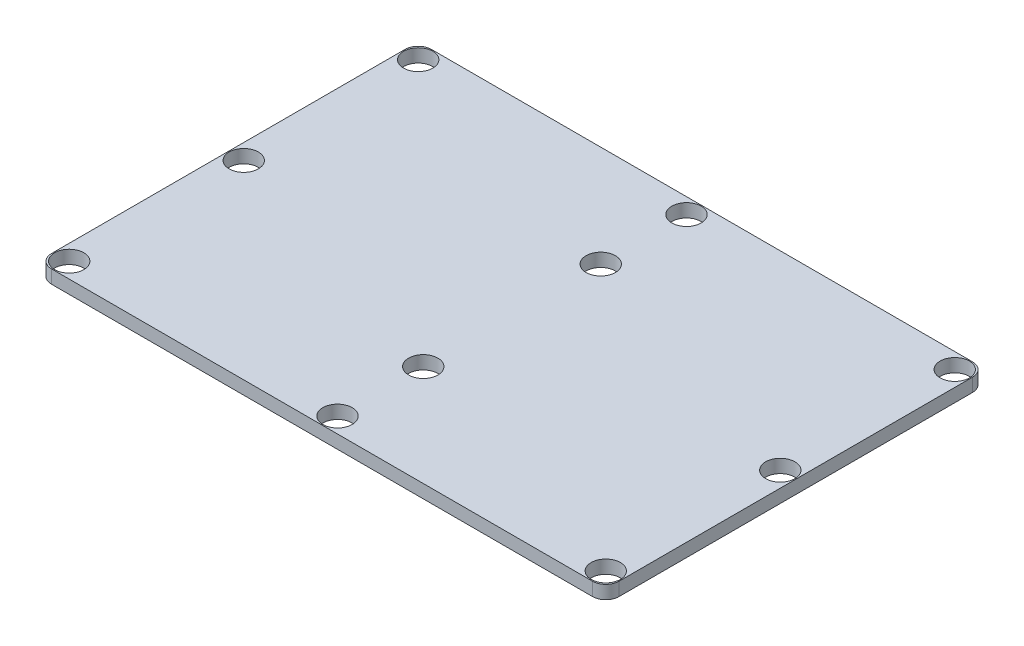
ISO-10303-21;
HEADER;
FILE_DESCRIPTION(('STEP AP214'),'2;1');
FILE_NAME('part.step','',(''),(''),'','','');
FILE_SCHEMA(('AUTOMOTIVE_DESIGN { 1 0 10303 214 1 1 1 1 }'));
ENDSEC;
DATA;
#1=APPLICATION_CONTEXT('core data for automotive mechanical design processes');
#2=APPLICATION_PROTOCOL_DEFINITION('international standard','automotive_design',2000,#1);
#3=PRODUCT_CONTEXT('',#1,'mechanical');
#4=PRODUCT('Part','Part','',(#3));
#5=PRODUCT_RELATED_PRODUCT_CATEGORY('part','',(#4));
#6=PRODUCT_DEFINITION_FORMATION('','',#4);
#7=PRODUCT_DEFINITION_CONTEXT('part definition',#1,'design');
#8=PRODUCT_DEFINITION('design','',#6,#7);
#9=PRODUCT_DEFINITION_SHAPE('','',#8);
#10=(LENGTH_UNIT() NAMED_UNIT(*) SI_UNIT(.MILLI.,.METRE.));
#11=(NAMED_UNIT(*) PLANE_ANGLE_UNIT() SI_UNIT($,.RADIAN.));
#12=(NAMED_UNIT(*) SI_UNIT($,.STERADIAN.) SOLID_ANGLE_UNIT());
#13=UNCERTAINTY_MEASURE_WITH_UNIT(LENGTH_MEASURE(1.E-05),#10,'distance_accuracy_value','');
#14=(GEOMETRIC_REPRESENTATION_CONTEXT(3) GLOBAL_UNCERTAINTY_ASSIGNED_CONTEXT((#13)) GLOBAL_UNIT_ASSIGNED_CONTEXT((#10,
#11,#12)) REPRESENTATION_CONTEXT('',''));
#15=CARTESIAN_POINT('',(0.,0.,0.));
#16=DIRECTION('',(0.,0.,1.));
#17=DIRECTION('',(1.,0.,0.));
#18=AXIS2_PLACEMENT_3D('',#15,#16,#17);
#19=CARTESIAN_POINT('',(64.,3.,42.85));
#20=DIRECTION('',(-1.,0.,0.));
#21=DIRECTION('',(0.,0.,1.));
#22=AXIS2_PLACEMENT_3D('',#19,#20,#21);
#23=PLANE('',#22);
#24=DIRECTION('',(0.,0.,-1.));
#25=VECTOR('',#24,1.);
#26=CARTESIAN_POINT('',(64.,0.,42.85));
#27=LINE('',#26,#25);
#28=CARTESIAN_POINT('',(64.,0.,39.85));
#29=VERTEX_POINT('',#28);
#30=CARTESIAN_POINT('',(64.,0.,-39.85));
#31=VERTEX_POINT('',#30);
#32=EDGE_CURVE('E128',#29,#31,#27,.T.);
#33=ORIENTED_EDGE('',*,*,#32,.T.);
#34=DIRECTION('',(0.,-1.,0.));
#35=VECTOR('',#34,1.);
#36=CARTESIAN_POINT('',(64.,3.,-39.85));
#37=LINE('',#36,#35);
#38=CARTESIAN_POINT('',(64.,3.,-39.85));
#39=VERTEX_POINT('',#38);
#40=EDGE_CURVE('E105',#31,#39,#37,.F.);
#41=ORIENTED_EDGE('',*,*,#40,.T.);
#42=DIRECTION('',(0.,0.,-1.));
#43=VECTOR('',#42,1.);
#44=CARTESIAN_POINT('',(64.,3.,42.85));
#45=LINE('',#44,#43);
#46=CARTESIAN_POINT('',(64.,3.,39.85));
#47=VERTEX_POINT('',#46);
#48=EDGE_CURVE('E138',#47,#39,#45,.T.);
#49=ORIENTED_EDGE('',*,*,#48,.F.);
#50=DIRECTION('',(0.,-1.,0.));
#51=VECTOR('',#50,1.);
#52=CARTESIAN_POINT('',(64.,3.,39.85));
#53=LINE('',#52,#51);
#54=EDGE_CURVE('E110',#47,#29,#53,.T.);
#55=ORIENTED_EDGE('',*,*,#54,.T.);
#56=EDGE_LOOP('',(#33,#41,#49,#55));
#57=FACE_BOUND('',#56,.T.);
#58=ADVANCED_FACE('F33',(#57),#23,.F.);
#59=CARTESIAN_POINT('',(-64.,3.,-42.85));
#60=DIRECTION('',(0.,0.,1.));
#61=DIRECTION('',(1.,0.,0.));
#62=AXIS2_PLACEMENT_3D('',#59,#60,#61);
#63=PLANE('',#62);
#64=DIRECTION('',(-1.,0.,0.));
#65=VECTOR('',#64,1.);
#66=CARTESIAN_POINT('',(-64.,3.,-42.85));
#67=LINE('',#66,#65);
#68=CARTESIAN_POINT('',(61.,3.,-42.85));
#69=VERTEX_POINT('',#68);
#70=CARTESIAN_POINT('',(-61.,3.,-42.85));
#71=VERTEX_POINT('',#70);
#72=EDGE_CURVE('E120',#69,#71,#67,.T.);
#73=ORIENTED_EDGE('',*,*,#72,.F.);
#74=DIRECTION('',(0.,-1.,0.));
#75=VECTOR('',#74,1.);
#76=CARTESIAN_POINT('',(61.,3.,-42.85));
#77=LINE('',#76,#75);
#78=CARTESIAN_POINT('',(61.,0.,-42.85));
#79=VERTEX_POINT('',#78);
#80=EDGE_CURVE('E104',#69,#79,#77,.T.);
#81=ORIENTED_EDGE('',*,*,#80,.T.);
#82=DIRECTION('',(-1.,0.,0.));
#83=VECTOR('',#82,1.);
#84=CARTESIAN_POINT('',(-64.,0.,-42.85));
#85=LINE('',#84,#83);
#86=CARTESIAN_POINT('',(-61.,0.,-42.85));
#87=VERTEX_POINT('',#86);
#88=EDGE_CURVE('E117',#79,#87,#85,.T.);
#89=ORIENTED_EDGE('',*,*,#88,.T.);
#90=DIRECTION('',(0.,-1.,0.));
#91=VECTOR('',#90,1.);
#92=CARTESIAN_POINT('',(-61.,3.,-42.85));
#93=LINE('',#92,#91);
#94=EDGE_CURVE('E122',#87,#71,#93,.F.);
#95=ORIENTED_EDGE('',*,*,#94,.T.);
#96=EDGE_LOOP('',(#73,#81,#89,#95));
#97=FACE_BOUND('',#96,.T.);
#98=ADVANCED_FACE('F116',(#97),#63,.F.);
#99=CARTESIAN_POINT('',(-64.,3.,42.85));
#100=DIRECTION('',(1.,0.,0.));
#101=DIRECTION('',(0.,0.,-1.));
#102=AXIS2_PLACEMENT_3D('',#99,#100,#101);
#103=PLANE('',#102);
#104=DIRECTION('',(0.,0.,1.));
#105=VECTOR('',#104,1.);
#106=CARTESIAN_POINT('',(-64.,3.,42.85));
#107=LINE('',#106,#105);
#108=CARTESIAN_POINT('',(-64.,3.,-39.85));
#109=VERTEX_POINT('',#108);
#110=CARTESIAN_POINT('',(-64.,3.,39.85));
#111=VERTEX_POINT('',#110);
#112=EDGE_CURVE('E161',#109,#111,#107,.T.);
#113=ORIENTED_EDGE('',*,*,#112,.F.);
#114=DIRECTION('',(0.,-1.,0.));
#115=VECTOR('',#114,1.);
#116=CARTESIAN_POINT('',(-64.,3.,-39.85));
#117=LINE('',#116,#115);
#118=CARTESIAN_POINT('',(-64.,0.,-39.85));
#119=VERTEX_POINT('',#118);
#120=EDGE_CURVE('E11',#109,#119,#117,.T.);
#121=ORIENTED_EDGE('',*,*,#120,.T.);
#122=DIRECTION('',(0.,0.,1.));
#123=VECTOR('',#122,1.);
#124=CARTESIAN_POINT('',(-64.,0.,42.85));
#125=LINE('',#124,#123);
#126=CARTESIAN_POINT('',(-64.,0.,39.85));
#127=VERTEX_POINT('',#126);
#128=EDGE_CURVE('E127',#119,#127,#125,.T.);
#129=ORIENTED_EDGE('',*,*,#128,.T.);
#130=DIRECTION('',(0.,-1.,0.));
#131=VECTOR('',#130,1.);
#132=CARTESIAN_POINT('',(-64.,3.,39.85));
#133=LINE('',#132,#131);
#134=EDGE_CURVE('E41',#127,#111,#133,.F.);
#135=ORIENTED_EDGE('',*,*,#134,.T.);
#136=EDGE_LOOP('',(#113,#121,#129,#135));
#137=FACE_BOUND('',#136,.T.);
#138=ADVANCED_FACE('F160',(#137),#103,.F.);
#139=CARTESIAN_POINT('',(-64.,3.,42.85));
#140=DIRECTION('',(0.,0.,-1.));
#141=DIRECTION('',(-1.,0.,0.));
#142=AXIS2_PLACEMENT_3D('',#139,#140,#141);
#143=PLANE('',#142);
#144=DIRECTION('',(1.,0.,0.));
#145=VECTOR('',#144,1.);
#146=CARTESIAN_POINT('',(-64.,0.,42.85));
#147=LINE('',#146,#145);
#148=CARTESIAN_POINT('',(-61.,0.,42.85));
#149=VERTEX_POINT('',#148);
#150=CARTESIAN_POINT('',(61.,0.,42.85));
#151=VERTEX_POINT('',#150);
#152=EDGE_CURVE('E131',#149,#151,#147,.T.);
#153=ORIENTED_EDGE('',*,*,#152,.T.);
#154=DIRECTION('',(0.,-1.,0.));
#155=VECTOR('',#154,1.);
#156=CARTESIAN_POINT('',(61.,3.,42.85));
#157=LINE('',#156,#155);
#158=CARTESIAN_POINT('',(61.,3.,42.85));
#159=VERTEX_POINT('',#158);
#160=EDGE_CURVE('E48',#151,#159,#157,.F.);
#161=ORIENTED_EDGE('',*,*,#160,.T.);
#162=DIRECTION('',(1.,0.,0.));
#163=VECTOR('',#162,1.);
#164=CARTESIAN_POINT('',(-64.,3.,42.85));
#165=LINE('',#164,#163);
#166=CARTESIAN_POINT('',(-61.,3.,42.85));
#167=VERTEX_POINT('',#166);
#168=EDGE_CURVE('E139',#167,#159,#165,.T.);
#169=ORIENTED_EDGE('',*,*,#168,.F.);
#170=DIRECTION('',(0.,-1.,0.));
#171=VECTOR('',#170,1.);
#172=CARTESIAN_POINT('',(-61.,3.,42.85));
#173=LINE('',#172,#171);
#174=EDGE_CURVE('E154',#167,#149,#173,.T.);
#175=ORIENTED_EDGE('',*,*,#174,.T.);
#176=EDGE_LOOP('',(#153,#161,#169,#175));
#177=FACE_BOUND('',#176,.T.);
#178=ADVANCED_FACE('F170',(#177),#143,.F.);
#179=CARTESIAN_POINT('',(0.,3.,0.));
#180=DIRECTION('',(0.,-1.,0.));
#181=DIRECTION('',(0.,0.,-1.));
#182=AXIS2_PLACEMENT_3D('',#179,#180,#181);
#183=PLANE('',#182);
#184=CARTESIAN_POINT('',(-60.5,3.,-39.35));
#185=DIRECTION('',(0.,1.,0.));
#186=DIRECTION('',(0.,0.,1.));
#187=AXIS2_PLACEMENT_3D('',#184,#185,#186);
#188=CIRCLE('',#187,3.3);
#189=CARTESIAN_POINT('',(-60.5,3.,-36.05));
#190=VERTEX_POINT('',#189);
#191=EDGE_CURVE('E236',#190,#190,#188,.T.);
#192=ORIENTED_EDGE('',*,*,#191,.F.);
#193=EDGE_LOOP('',(#192));
#194=FACE_BOUND('',#193,.T.);
#195=CARTESIAN_POINT('',(0.,3.,-39.35));
#196=DIRECTION('',(0.,1.,0.));
#197=DIRECTION('',(0.,0.,1.));
#198=AXIS2_PLACEMENT_3D('',#195,#196,#197);
#199=CIRCLE('',#198,3.3);
#200=CARTESIAN_POINT('',(0.,3.,-36.05));
#201=VERTEX_POINT('',#200);
#202=EDGE_CURVE('E230',#201,#201,#199,.T.);
#203=ORIENTED_EDGE('',*,*,#202,.F.);
#204=EDGE_LOOP('',(#203));
#205=FACE_BOUND('',#204,.T.);
#206=CARTESIAN_POINT('',(60.5,3.,-39.35));
#207=DIRECTION('',(0.,1.,0.));
#208=DIRECTION('',(0.,0.,1.));
#209=AXIS2_PLACEMENT_3D('',#206,#207,#208);
#210=CIRCLE('',#209,3.3);
#211=CARTESIAN_POINT('',(60.5,3.,-36.05));
#212=VERTEX_POINT('',#211);
#213=EDGE_CURVE('E224',#212,#212,#210,.T.);
#214=ORIENTED_EDGE('',*,*,#213,.F.);
#215=EDGE_LOOP('',(#214));
#216=FACE_BOUND('',#215,.T.);
#217=CARTESIAN_POINT('',(60.5,3.,0.));
#218=DIRECTION('',(0.,1.,0.));
#219=DIRECTION('',(0.,0.,1.));
#220=AXIS2_PLACEMENT_3D('',#217,#218,#219);
#221=CIRCLE('',#220,3.3);
#222=CARTESIAN_POINT('',(60.5,3.,3.3));
#223=VERTEX_POINT('',#222);
#224=EDGE_CURVE('E218',#223,#223,#221,.T.);
#225=ORIENTED_EDGE('',*,*,#224,.F.);
#226=EDGE_LOOP('',(#225));
#227=FACE_BOUND('',#226,.T.);
#228=CARTESIAN_POINT('',(60.5,3.,39.35));
#229=DIRECTION('',(0.,1.,0.));
#230=DIRECTION('',(0.,0.,1.));
#231=AXIS2_PLACEMENT_3D('',#228,#229,#230);
#232=CIRCLE('',#231,3.3);
#233=CARTESIAN_POINT('',(60.5,3.,42.65));
#234=VERTEX_POINT('',#233);
#235=EDGE_CURVE('E212',#234,#234,#232,.T.);
#236=ORIENTED_EDGE('',*,*,#235,.F.);
#237=EDGE_LOOP('',(#236));
#238=FACE_BOUND('',#237,.T.);
#239=CARTESIAN_POINT('',(0.,3.,39.35));
#240=DIRECTION('',(0.,1.,0.));
#241=DIRECTION('',(0.,0.,1.));
#242=AXIS2_PLACEMENT_3D('',#239,#240,#241);
#243=CIRCLE('',#242,3.3);
#244=CARTESIAN_POINT('',(0.,3.,42.65));
#245=VERTEX_POINT('',#244);
#246=EDGE_CURVE('E206',#245,#245,#243,.T.);
#247=ORIENTED_EDGE('',*,*,#246,.F.);
#248=EDGE_LOOP('',(#247));
#249=FACE_BOUND('',#248,.T.);
#250=CARTESIAN_POINT('',(-60.5,3.,39.35));
#251=DIRECTION('',(0.,1.,0.));
#252=DIRECTION('',(0.,0.,1.));
#253=AXIS2_PLACEMENT_3D('',#250,#251,#252);
#254=CIRCLE('',#253,3.3);
#255=CARTESIAN_POINT('',(-60.5,3.,42.65));
#256=VERTEX_POINT('',#255);
#257=EDGE_CURVE('E200',#256,#256,#254,.T.);
#258=ORIENTED_EDGE('',*,*,#257,.F.);
#259=EDGE_LOOP('',(#258));
#260=FACE_BOUND('',#259,.T.);
#261=CARTESIAN_POINT('',(-60.5,3.,0.));
#262=DIRECTION('',(0.,1.,0.));
#263=DIRECTION('',(0.,0.,1.));
#264=AXIS2_PLACEMENT_3D('',#261,#262,#263);
#265=CIRCLE('',#264,3.3);
#266=CARTESIAN_POINT('',(-60.5,3.,3.3));
#267=VERTEX_POINT('',#266);
#268=EDGE_CURVE('E194',#267,#267,#265,.T.);
#269=ORIENTED_EDGE('',*,*,#268,.F.);
#270=EDGE_LOOP('',(#269));
#271=FACE_BOUND('',#270,.T.);
#272=CARTESIAN_POINT('',(0.,3.,20.01));
#273=DIRECTION('',(0.,1.,0.));
#274=DIRECTION('',(0.,0.,1.));
#275=AXIS2_PLACEMENT_3D('',#272,#273,#274);
#276=CIRCLE('',#275,3.3);
#277=CARTESIAN_POINT('',(0.,3.,23.31));
#278=VERTEX_POINT('',#277);
#279=EDGE_CURVE('E188',#278,#278,#276,.T.);
#280=ORIENTED_EDGE('',*,*,#279,.F.);
#281=EDGE_LOOP('',(#280));
#282=FACE_BOUND('',#281,.T.);
#283=CARTESIAN_POINT('',(0.,3.,-20.01));
#284=DIRECTION('',(0.,1.,0.));
#285=DIRECTION('',(0.,0.,1.));
#286=AXIS2_PLACEMENT_3D('',#283,#284,#285);
#287=CIRCLE('',#286,3.3);
#288=CARTESIAN_POINT('',(0.,3.,-16.71));
#289=VERTEX_POINT('',#288);
#290=EDGE_CURVE('E182',#289,#289,#287,.T.);
#291=ORIENTED_EDGE('',*,*,#290,.F.);
#292=EDGE_LOOP('',(#291));
#293=FACE_BOUND('',#292,.T.);
#294=ORIENTED_EDGE('',*,*,#48,.T.);
#295=CARTESIAN_POINT('',(61.,3.,-39.85));
#296=DIRECTION('',(0.,-1.,0.));
#297=DIRECTION('',(0.,0.,-1.));
#298=AXIS2_PLACEMENT_3D('',#295,#296,#297);
#299=CIRCLE('',#298,3.);
#300=EDGE_CURVE('E152',#39,#69,#299,.F.);
#301=ORIENTED_EDGE('',*,*,#300,.T.);
#302=ORIENTED_EDGE('',*,*,#72,.T.);
#303=CARTESIAN_POINT('',(-61.,3.,-39.85));
#304=DIRECTION('',(0.,-1.,0.));
#305=DIRECTION('',(0.,0.,-1.));
#306=AXIS2_PLACEMENT_3D('',#303,#304,#305);
#307=CIRCLE('',#306,3.);
#308=EDGE_CURVE('E148',#71,#109,#307,.F.);
#309=ORIENTED_EDGE('',*,*,#308,.T.);
#310=ORIENTED_EDGE('',*,*,#112,.T.);
#311=CARTESIAN_POINT('',(-61.,3.,39.85));
#312=DIRECTION('',(0.,-1.,0.));
#313=DIRECTION('',(0.,0.,-1.));
#314=AXIS2_PLACEMENT_3D('',#311,#312,#313);
#315=CIRCLE('',#314,3.);
#316=EDGE_CURVE('E55',#111,#167,#315,.F.);
#317=ORIENTED_EDGE('',*,*,#316,.T.);
#318=ORIENTED_EDGE('',*,*,#168,.T.);
#319=CARTESIAN_POINT('',(61.,3.,39.85));
#320=DIRECTION('',(0.,-1.,0.));
#321=DIRECTION('',(0.,0.,-1.));
#322=AXIS2_PLACEMENT_3D('',#319,#320,#321);
#323=CIRCLE('',#322,3.);
#324=EDGE_CURVE('E150',#159,#47,#323,.F.);
#325=ORIENTED_EDGE('',*,*,#324,.T.);
#326=EDGE_LOOP('',(#294,#301,#302,#309,#310,#317,#318,#325));
#327=FACE_BOUND('',#326,.T.);
#328=ADVANCED_FACE('F165',(#194,#205,#216,#227,#238,#249,#260,#271,#282,#293,#327),#183,.F.);
#329=CARTESIAN_POINT('',(0.,0.,0.));
#330=DIRECTION('',(0.,-1.,0.));
#331=DIRECTION('',(0.,0.,-1.));
#332=AXIS2_PLACEMENT_3D('',#329,#330,#331);
#333=PLANE('',#332);
#334=CARTESIAN_POINT('',(-60.5,0.,-39.35));
#335=DIRECTION('',(0.,1.,0.));
#336=DIRECTION('',(0.,0.,1.));
#337=AXIS2_PLACEMENT_3D('',#334,#335,#336);
#338=CIRCLE('',#337,3.3);
#339=CARTESIAN_POINT('',(-60.5,0.,-36.05));
#340=VERTEX_POINT('',#339);
#341=EDGE_CURVE('E233',#340,#340,#338,.T.);
#342=ORIENTED_EDGE('',*,*,#341,.T.);
#343=EDGE_LOOP('',(#342));
#344=FACE_BOUND('',#343,.T.);
#345=CARTESIAN_POINT('',(0.,0.,-39.35));
#346=DIRECTION('',(0.,1.,0.));
#347=DIRECTION('',(0.,0.,1.));
#348=AXIS2_PLACEMENT_3D('',#345,#346,#347);
#349=CIRCLE('',#348,3.3);
#350=CARTESIAN_POINT('',(0.,0.,-36.05));
#351=VERTEX_POINT('',#350);
#352=EDGE_CURVE('E227',#351,#351,#349,.T.);
#353=ORIENTED_EDGE('',*,*,#352,.T.);
#354=EDGE_LOOP('',(#353));
#355=FACE_BOUND('',#354,.T.);
#356=CARTESIAN_POINT('',(60.5,0.,-39.35));
#357=DIRECTION('',(0.,1.,0.));
#358=DIRECTION('',(0.,0.,1.));
#359=AXIS2_PLACEMENT_3D('',#356,#357,#358);
#360=CIRCLE('',#359,3.3);
#361=CARTESIAN_POINT('',(60.5,0.,-36.05));
#362=VERTEX_POINT('',#361);
#363=EDGE_CURVE('E221',#362,#362,#360,.T.);
#364=ORIENTED_EDGE('',*,*,#363,.T.);
#365=EDGE_LOOP('',(#364));
#366=FACE_BOUND('',#365,.T.);
#367=CARTESIAN_POINT('',(60.5,0.,0.));
#368=DIRECTION('',(0.,1.,0.));
#369=DIRECTION('',(0.,0.,1.));
#370=AXIS2_PLACEMENT_3D('',#367,#368,#369);
#371=CIRCLE('',#370,3.3);
#372=CARTESIAN_POINT('',(60.5,0.,3.3));
#373=VERTEX_POINT('',#372);
#374=EDGE_CURVE('E215',#373,#373,#371,.T.);
#375=ORIENTED_EDGE('',*,*,#374,.T.);
#376=EDGE_LOOP('',(#375));
#377=FACE_BOUND('',#376,.T.);
#378=CARTESIAN_POINT('',(60.5,0.,39.35));
#379=DIRECTION('',(0.,1.,0.));
#380=DIRECTION('',(0.,0.,1.));
#381=AXIS2_PLACEMENT_3D('',#378,#379,#380);
#382=CIRCLE('',#381,3.3);
#383=CARTESIAN_POINT('',(60.5,0.,42.65));
#384=VERTEX_POINT('',#383);
#385=EDGE_CURVE('E209',#384,#384,#382,.T.);
#386=ORIENTED_EDGE('',*,*,#385,.T.);
#387=EDGE_LOOP('',(#386));
#388=FACE_BOUND('',#387,.T.);
#389=CARTESIAN_POINT('',(0.,0.,39.35));
#390=DIRECTION('',(0.,1.,0.));
#391=DIRECTION('',(0.,0.,1.));
#392=AXIS2_PLACEMENT_3D('',#389,#390,#391);
#393=CIRCLE('',#392,3.3);
#394=CARTESIAN_POINT('',(0.,0.,42.65));
#395=VERTEX_POINT('',#394);
#396=EDGE_CURVE('E203',#395,#395,#393,.T.);
#397=ORIENTED_EDGE('',*,*,#396,.T.);
#398=EDGE_LOOP('',(#397));
#399=FACE_BOUND('',#398,.T.);
#400=CARTESIAN_POINT('',(-60.5,0.,39.35));
#401=DIRECTION('',(0.,1.,0.));
#402=DIRECTION('',(0.,0.,1.));
#403=AXIS2_PLACEMENT_3D('',#400,#401,#402);
#404=CIRCLE('',#403,3.3);
#405=CARTESIAN_POINT('',(-60.5,0.,42.65));
#406=VERTEX_POINT('',#405);
#407=EDGE_CURVE('E197',#406,#406,#404,.T.);
#408=ORIENTED_EDGE('',*,*,#407,.T.);
#409=EDGE_LOOP('',(#408));
#410=FACE_BOUND('',#409,.T.);
#411=CARTESIAN_POINT('',(-60.5,0.,0.));
#412=DIRECTION('',(0.,1.,0.));
#413=DIRECTION('',(0.,0.,1.));
#414=AXIS2_PLACEMENT_3D('',#411,#412,#413);
#415=CIRCLE('',#414,3.3);
#416=CARTESIAN_POINT('',(-60.5,0.,3.3));
#417=VERTEX_POINT('',#416);
#418=EDGE_CURVE('E191',#417,#417,#415,.T.);
#419=ORIENTED_EDGE('',*,*,#418,.T.);
#420=EDGE_LOOP('',(#419));
#421=FACE_BOUND('',#420,.T.);
#422=CARTESIAN_POINT('',(0.,0.,20.01));
#423=DIRECTION('',(0.,1.,0.));
#424=DIRECTION('',(0.,0.,1.));
#425=AXIS2_PLACEMENT_3D('',#422,#423,#424);
#426=CIRCLE('',#425,3.3);
#427=CARTESIAN_POINT('',(0.,0.,23.31));
#428=VERTEX_POINT('',#427);
#429=EDGE_CURVE('E185',#428,#428,#426,.T.);
#430=ORIENTED_EDGE('',*,*,#429,.T.);
#431=EDGE_LOOP('',(#430));
#432=FACE_BOUND('',#431,.T.);
#433=CARTESIAN_POINT('',(0.,0.,-20.01));
#434=DIRECTION('',(0.,1.,0.));
#435=DIRECTION('',(0.,0.,1.));
#436=AXIS2_PLACEMENT_3D('',#433,#434,#435);
#437=CIRCLE('',#436,3.3);
#438=CARTESIAN_POINT('',(0.,0.,-16.71));
#439=VERTEX_POINT('',#438);
#440=EDGE_CURVE('E133',#439,#439,#437,.T.);
#441=ORIENTED_EDGE('',*,*,#440,.T.);
#442=EDGE_LOOP('',(#441));
#443=FACE_BOUND('',#442,.T.);
#444=ORIENTED_EDGE('',*,*,#88,.F.);
#445=CARTESIAN_POINT('',(61.,0.,-39.85));
#446=DIRECTION('',(0.,-1.,0.));
#447=DIRECTION('',(0.,0.,-1.));
#448=AXIS2_PLACEMENT_3D('',#445,#446,#447);
#449=CIRCLE('',#448,3.);
#450=EDGE_CURVE('E100',#79,#31,#449,.T.);
#451=ORIENTED_EDGE('',*,*,#450,.T.);
#452=ORIENTED_EDGE('',*,*,#32,.F.);
#453=CARTESIAN_POINT('',(61.,0.,39.85));
#454=DIRECTION('',(0.,-1.,0.));
#455=DIRECTION('',(0.,0.,-1.));
#456=AXIS2_PLACEMENT_3D('',#453,#454,#455);
#457=CIRCLE('',#456,3.);
#458=EDGE_CURVE('E111',#29,#151,#457,.T.);
#459=ORIENTED_EDGE('',*,*,#458,.T.);
#460=ORIENTED_EDGE('',*,*,#152,.F.);
#461=CARTESIAN_POINT('',(-61.,0.,39.85));
#462=DIRECTION('',(0.,-1.,0.));
#463=DIRECTION('',(0.,0.,-1.));
#464=AXIS2_PLACEMENT_3D('',#461,#462,#463);
#465=CIRCLE('',#464,3.);
#466=EDGE_CURVE('E121',#149,#127,#465,.T.);
#467=ORIENTED_EDGE('',*,*,#466,.T.);
#468=ORIENTED_EDGE('',*,*,#128,.F.);
#469=CARTESIAN_POINT('',(-61.,0.,-39.85));
#470=DIRECTION('',(0.,-1.,0.));
#471=DIRECTION('',(0.,0.,-1.));
#472=AXIS2_PLACEMENT_3D('',#469,#470,#471);
#473=CIRCLE('',#472,3.);
#474=EDGE_CURVE('E126',#119,#87,#473,.T.);
#475=ORIENTED_EDGE('',*,*,#474,.T.);
#476=EDGE_LOOP('',(#444,#451,#452,#459,#460,#467,#468,#475));
#477=FACE_BOUND('',#476,.T.);
#478=ADVANCED_FACE('F124',(#344,#355,#366,#377,#388,#399,#410,#421,#432,#443,#477),#333,.T.);
#479=CARTESIAN_POINT('',(0.,3.,-20.01));
#480=DIRECTION('',(0.,1.,0.));
#481=DIRECTION('',(0.,0.,1.));
#482=AXIS2_PLACEMENT_3D('',#479,#480,#481);
#483=CYLINDRICAL_SURFACE('',#482,3.3);
#484=ORIENTED_EDGE('',*,*,#440,.F.);
#485=EDGE_LOOP('',(#484));
#486=FACE_BOUND('',#485,.T.);
#487=ORIENTED_EDGE('',*,*,#290,.T.);
#488=EDGE_LOOP('',(#487));
#489=FACE_BOUND('',#488,.T.);
#490=ADVANCED_FACE('F263',(#486,#489),#483,.F.);
#491=CARTESIAN_POINT('',(0.,3.,20.01));
#492=DIRECTION('',(0.,1.,0.));
#493=DIRECTION('',(0.,0.,1.));
#494=AXIS2_PLACEMENT_3D('',#491,#492,#493);
#495=CYLINDRICAL_SURFACE('',#494,3.3);
#496=ORIENTED_EDGE('',*,*,#429,.F.);
#497=EDGE_LOOP('',(#496));
#498=FACE_BOUND('',#497,.T.);
#499=ORIENTED_EDGE('',*,*,#279,.T.);
#500=EDGE_LOOP('',(#499));
#501=FACE_BOUND('',#500,.T.);
#502=ADVANCED_FACE('F265',(#498,#501),#495,.F.);
#503=CARTESIAN_POINT('',(-60.5,3.,0.));
#504=DIRECTION('',(0.,1.,0.));
#505=DIRECTION('',(0.,0.,1.));
#506=AXIS2_PLACEMENT_3D('',#503,#504,#505);
#507=CYLINDRICAL_SURFACE('',#506,3.3);
#508=ORIENTED_EDGE('',*,*,#418,.F.);
#509=EDGE_LOOP('',(#508));
#510=FACE_BOUND('',#509,.T.);
#511=ORIENTED_EDGE('',*,*,#268,.T.);
#512=EDGE_LOOP('',(#511));
#513=FACE_BOUND('',#512,.T.);
#514=ADVANCED_FACE('F272',(#510,#513),#507,.F.);
#515=CARTESIAN_POINT('',(-60.5,3.,39.35));
#516=DIRECTION('',(0.,1.,0.));
#517=DIRECTION('',(0.,0.,1.));
#518=AXIS2_PLACEMENT_3D('',#515,#516,#517);
#519=CYLINDRICAL_SURFACE('',#518,3.3);
#520=ORIENTED_EDGE('',*,*,#407,.F.);
#521=EDGE_LOOP('',(#520));
#522=FACE_BOUND('',#521,.T.);
#523=ORIENTED_EDGE('',*,*,#257,.T.);
#524=EDGE_LOOP('',(#523));
#525=FACE_BOUND('',#524,.T.);
#526=ADVANCED_FACE('F410',(#522,#525),#519,.F.);
#527=CARTESIAN_POINT('',(0.,3.,39.35));
#528=DIRECTION('',(0.,1.,0.));
#529=DIRECTION('',(0.,0.,1.));
#530=AXIS2_PLACEMENT_3D('',#527,#528,#529);
#531=CYLINDRICAL_SURFACE('',#530,3.3);
#532=ORIENTED_EDGE('',*,*,#396,.F.);
#533=EDGE_LOOP('',(#532));
#534=FACE_BOUND('',#533,.T.);
#535=ORIENTED_EDGE('',*,*,#246,.T.);
#536=EDGE_LOOP('',(#535));
#537=FACE_BOUND('',#536,.T.);
#538=ADVANCED_FACE('F400',(#534,#537),#531,.F.);
#539=CARTESIAN_POINT('',(60.5,3.,39.35));
#540=DIRECTION('',(0.,1.,0.));
#541=DIRECTION('',(0.,0.,1.));
#542=AXIS2_PLACEMENT_3D('',#539,#540,#541);
#543=CYLINDRICAL_SURFACE('',#542,3.3);
#544=ORIENTED_EDGE('',*,*,#385,.F.);
#545=EDGE_LOOP('',(#544));
#546=FACE_BOUND('',#545,.T.);
#547=ORIENTED_EDGE('',*,*,#235,.T.);
#548=EDGE_LOOP('',(#547));
#549=FACE_BOUND('',#548,.T.);
#550=ADVANCED_FACE('F390',(#546,#549),#543,.F.);
#551=CARTESIAN_POINT('',(60.5,3.,0.));
#552=DIRECTION('',(0.,1.,0.));
#553=DIRECTION('',(0.,0.,1.));
#554=AXIS2_PLACEMENT_3D('',#551,#552,#553);
#555=CYLINDRICAL_SURFACE('',#554,3.3);
#556=ORIENTED_EDGE('',*,*,#374,.F.);
#557=EDGE_LOOP('',(#556));
#558=FACE_BOUND('',#557,.T.);
#559=ORIENTED_EDGE('',*,*,#224,.T.);
#560=EDGE_LOOP('',(#559));
#561=FACE_BOUND('',#560,.T.);
#562=ADVANCED_FACE('F380',(#558,#561),#555,.F.);
#563=CARTESIAN_POINT('',(60.5,3.,-39.35));
#564=DIRECTION('',(0.,1.,0.));
#565=DIRECTION('',(0.,0.,1.));
#566=AXIS2_PLACEMENT_3D('',#563,#564,#565);
#567=CYLINDRICAL_SURFACE('',#566,3.3);
#568=ORIENTED_EDGE('',*,*,#363,.F.);
#569=EDGE_LOOP('',(#568));
#570=FACE_BOUND('',#569,.T.);
#571=ORIENTED_EDGE('',*,*,#213,.T.);
#572=EDGE_LOOP('',(#571));
#573=FACE_BOUND('',#572,.T.);
#574=ADVANCED_FACE('F370',(#570,#573),#567,.F.);
#575=CARTESIAN_POINT('',(0.,3.,-39.35));
#576=DIRECTION('',(0.,1.,0.));
#577=DIRECTION('',(0.,0.,1.));
#578=AXIS2_PLACEMENT_3D('',#575,#576,#577);
#579=CYLINDRICAL_SURFACE('',#578,3.3);
#580=ORIENTED_EDGE('',*,*,#352,.F.);
#581=EDGE_LOOP('',(#580));
#582=FACE_BOUND('',#581,.T.);
#583=ORIENTED_EDGE('',*,*,#202,.T.);
#584=EDGE_LOOP('',(#583));
#585=FACE_BOUND('',#584,.T.);
#586=ADVANCED_FACE('F360',(#582,#585),#579,.F.);
#587=CARTESIAN_POINT('',(-60.5,3.,-39.35));
#588=DIRECTION('',(0.,1.,0.));
#589=DIRECTION('',(0.,0.,1.));
#590=AXIS2_PLACEMENT_3D('',#587,#588,#589);
#591=CYLINDRICAL_SURFACE('',#590,3.3);
#592=ORIENTED_EDGE('',*,*,#341,.F.);
#593=EDGE_LOOP('',(#592));
#594=FACE_BOUND('',#593,.T.);
#595=ORIENTED_EDGE('',*,*,#191,.T.);
#596=EDGE_LOOP('',(#595));
#597=FACE_BOUND('',#596,.T.);
#598=ADVANCED_FACE('F240',(#594,#597),#591,.F.);
#599=CARTESIAN_POINT('',(61.,3.,-39.85));
#600=DIRECTION('',(0.,-1.,0.));
#601=DIRECTION('',(0.,0.,-1.));
#602=AXIS2_PLACEMENT_3D('',#599,#600,#601);
#603=CYLINDRICAL_SURFACE('',#602,3.);
#604=ORIENTED_EDGE('',*,*,#300,.F.);
#605=ORIENTED_EDGE('',*,*,#40,.F.);
#606=ORIENTED_EDGE('',*,*,#450,.F.);
#607=ORIENTED_EDGE('',*,*,#80,.F.);
#608=EDGE_LOOP('',(#604,#605,#606,#607));
#609=FACE_BOUND('',#608,.T.);
#610=ADVANCED_FACE('F103',(#609),#603,.T.);
#611=CARTESIAN_POINT('',(61.,3.,39.85));
#612=DIRECTION('',(0.,-1.,0.));
#613=DIRECTION('',(0.,0.,-1.));
#614=AXIS2_PLACEMENT_3D('',#611,#612,#613);
#615=CYLINDRICAL_SURFACE('',#614,3.);
#616=ORIENTED_EDGE('',*,*,#324,.F.);
#617=ORIENTED_EDGE('',*,*,#160,.F.);
#618=ORIENTED_EDGE('',*,*,#458,.F.);
#619=ORIENTED_EDGE('',*,*,#54,.F.);
#620=EDGE_LOOP('',(#616,#617,#618,#619));
#621=FACE_BOUND('',#620,.T.);
#622=ADVANCED_FACE('F174',(#621),#615,.T.);
#623=CARTESIAN_POINT('',(-61.,3.,-39.85));
#624=DIRECTION('',(0.,-1.,0.));
#625=DIRECTION('',(0.,0.,-1.));
#626=AXIS2_PLACEMENT_3D('',#623,#624,#625);
#627=CYLINDRICAL_SURFACE('',#626,3.);
#628=ORIENTED_EDGE('',*,*,#308,.F.);
#629=ORIENTED_EDGE('',*,*,#94,.F.);
#630=ORIENTED_EDGE('',*,*,#474,.F.);
#631=ORIENTED_EDGE('',*,*,#120,.F.);
#632=EDGE_LOOP('',(#628,#629,#630,#631));
#633=FACE_BOUND('',#632,.T.);
#634=ADVANCED_FACE('F289',(#633),#627,.T.);
#635=CARTESIAN_POINT('',(-61.,3.,39.85));
#636=DIRECTION('',(0.,-1.,0.));
#637=DIRECTION('',(0.,0.,-1.));
#638=AXIS2_PLACEMENT_3D('',#635,#636,#637);
#639=CYLINDRICAL_SURFACE('',#638,3.);
#640=ORIENTED_EDGE('',*,*,#316,.F.);
#641=ORIENTED_EDGE('',*,*,#134,.F.);
#642=ORIENTED_EDGE('',*,*,#466,.F.);
#643=ORIENTED_EDGE('',*,*,#174,.F.);
#644=EDGE_LOOP('',(#640,#641,#642,#643));
#645=FACE_BOUND('',#644,.T.);
#646=ADVANCED_FACE('F35',(#645),#639,.T.);
#647=CLOSED_SHELL('',(#58,#98,#138,#178,#328,#478,#490,#502,#514,#526,#538,#550,#562,#574,#586,
#598,#610,#622,#634,#646));
#648=MANIFOLD_SOLID_BREP('B2',#647);
#649=ADVANCED_BREP_SHAPE_REPRESENTATION('',(#18,#648),#14);
#650=SHAPE_DEFINITION_REPRESENTATION(#9,#649);
ENDSEC;
END-ISO-10303-21;
